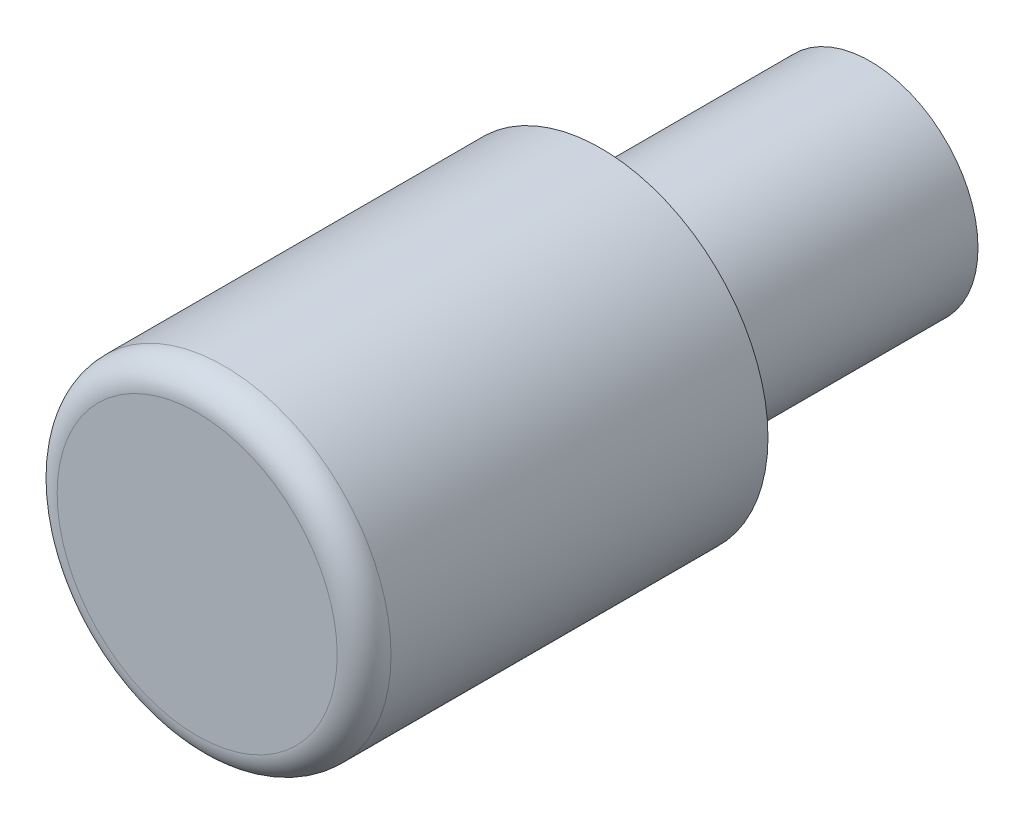
ISO-10303-21;
HEADER;
FILE_DESCRIPTION(('STEP AP214'),'2;1');
FILE_NAME('part.step','',(''),(''),'','','');
FILE_SCHEMA(('AUTOMOTIVE_DESIGN { 1 0 10303 214 1 1 1 1 }'));
ENDSEC;
DATA;
#1=APPLICATION_CONTEXT('core data for automotive mechanical design processes');
#2=APPLICATION_PROTOCOL_DEFINITION('international standard','automotive_design',2000,#1);
#3=PRODUCT_CONTEXT('',#1,'mechanical');
#4=PRODUCT('Part','Part','',(#3));
#5=PRODUCT_RELATED_PRODUCT_CATEGORY('part','',(#4));
#6=PRODUCT_DEFINITION_FORMATION('','',#4);
#7=PRODUCT_DEFINITION_CONTEXT('part definition',#1,'design');
#8=PRODUCT_DEFINITION('design','',#6,#7);
#9=PRODUCT_DEFINITION_SHAPE('','',#8);
#10=(LENGTH_UNIT() NAMED_UNIT(*) SI_UNIT(.MILLI.,.METRE.));
#11=(NAMED_UNIT(*) PLANE_ANGLE_UNIT() SI_UNIT($,.RADIAN.));
#12=(NAMED_UNIT(*) SI_UNIT($,.STERADIAN.) SOLID_ANGLE_UNIT());
#13=UNCERTAINTY_MEASURE_WITH_UNIT(LENGTH_MEASURE(1.E-05),#10,'distance_accuracy_value','');
#14=(GEOMETRIC_REPRESENTATION_CONTEXT(3) GLOBAL_UNCERTAINTY_ASSIGNED_CONTEXT((#13)) GLOBAL_UNIT_ASSIGNED_CONTEXT((#10,
#11,#12)) REPRESENTATION_CONTEXT('',''));
#15=CARTESIAN_POINT('',(0.,0.,0.));
#16=DIRECTION('',(0.,0.,1.));
#17=DIRECTION('',(1.,0.,0.));
#18=AXIS2_PLACEMENT_3D('',#15,#16,#17);
#19=CARTESIAN_POINT('',(0.,0.,0.));
#20=DIRECTION('',(0.,0.,1.));
#21=DIRECTION('',(1.,0.,0.));
#22=AXIS2_PLACEMENT_3D('',#19,#20,#21);
#23=PLANE('',#22);
#24=CARTESIAN_POINT('',(0.,0.,0.));
#25=DIRECTION('',(0.,0.,1.));
#26=DIRECTION('',(1.,0.,0.));
#27=AXIS2_PLACEMENT_3D('',#24,#25,#26);
#28=CIRCLE('',#27,1.5748);
#29=CARTESIAN_POINT('',(-1.5748,0.,0.));
#30=VERTEX_POINT('',#29);
#31=EDGE_CURVE('E46',#30,#30,#28,.T.);
#32=ORIENTED_EDGE('',*,*,#31,.F.);
#33=EDGE_LOOP('',(#32));
#34=FACE_BOUND('',#33,.T.);
#35=CARTESIAN_POINT('',(0.,0.,0.));
#36=DIRECTION('',(0.,0.,1.));
#37=DIRECTION('',(1.,0.,0.));
#38=AXIS2_PLACEMENT_3D('',#35,#36,#37);
#39=CIRCLE('',#38,1.016);
#40=CARTESIAN_POINT('',(1.016,0.,0.));
#41=VERTEX_POINT('',#40);
#42=EDGE_CURVE('E42',#41,#41,#39,.F.);
#43=ORIENTED_EDGE('',*,*,#42,.F.);
#44=EDGE_LOOP('',(#43));
#45=FACE_BOUND('',#44,.T.);
#46=ADVANCED_FACE('F31',(#34,#45),#23,.F.);
#47=CARTESIAN_POINT('',(0.,0.,3.81));
#48=DIRECTION('',(0.,0.,-1.));
#49=DIRECTION('',(-1.,0.,0.));
#50=AXIS2_PLACEMENT_3D('',#47,#48,#49);
#51=CYLINDRICAL_SURFACE('',#50,1.5748);
#52=CARTESIAN_POINT('',(0.,0.,3.556));
#53=DIRECTION('',(0.,0.,1.));
#54=DIRECTION('',(1.,0.,0.));
#55=AXIS2_PLACEMENT_3D('',#52,#53,#54);
#56=CIRCLE('',#55,1.5748);
#57=CARTESIAN_POINT('',(-1.5748,0.,3.556));
#58=VERTEX_POINT('',#57);
#59=EDGE_CURVE('E10',#58,#58,#56,.F.);
#60=CARTESIAN_POINT('',(-1.5748,0.,3.556));
#61=CARTESIAN_POINT('',(-1.5748,0.,3.51895833333333));
#62=CARTESIAN_POINT('',(-1.5748,0.,3.48191666666667));
#63=CARTESIAN_POINT('',(-1.5748,0.,3.40783333333333));
#64=CARTESIAN_POINT('',(-1.5748,0.,3.37079166666667));
#65=CARTESIAN_POINT('',(-1.5748,0.,3.29670833333333));
#66=CARTESIAN_POINT('',(-1.5748,0.,3.25966666666667));
#67=CARTESIAN_POINT('',(-1.5748,0.,3.18558333333333));
#68=CARTESIAN_POINT('',(-1.5748,0.,3.14854166666667));
#69=CARTESIAN_POINT('',(-1.5748,0.,3.07445833333333));
#70=CARTESIAN_POINT('',(-1.5748,0.,3.03741666666667));
#71=CARTESIAN_POINT('',(-1.5748,0.,2.96333333333333));
#72=CARTESIAN_POINT('',(-1.5748,0.,2.92629166666667));
#73=CARTESIAN_POINT('',(-1.5748,0.,2.85220833333333));
#74=CARTESIAN_POINT('',(-1.5748,0.,2.81516666666667));
#75=CARTESIAN_POINT('',(-1.5748,0.,2.74108333333333));
#76=CARTESIAN_POINT('',(-1.5748,0.,2.70404166666667));
#77=CARTESIAN_POINT('',(-1.5748,0.,2.62995833333333));
#78=CARTESIAN_POINT('',(-1.5748,0.,2.59291666666667));
#79=CARTESIAN_POINT('',(-1.5748,0.,2.51883333333333));
#80=CARTESIAN_POINT('',(-1.5748,0.,2.48179166666667));
#81=CARTESIAN_POINT('',(-1.5748,0.,2.40770833333333));
#82=CARTESIAN_POINT('',(-1.5748,0.,2.37066666666667));
#83=CARTESIAN_POINT('',(-1.5748,0.,2.29658333333333));
#84=CARTESIAN_POINT('',(-1.5748,0.,2.25954166666667));
#85=CARTESIAN_POINT('',(-1.5748,0.,2.18545833333333));
#86=CARTESIAN_POINT('',(-1.5748,0.,2.14841666666667));
#87=CARTESIAN_POINT('',(-1.5748,0.,2.07433333333333));
#88=CARTESIAN_POINT('',(-1.5748,0.,2.03729166666667));
#89=CARTESIAN_POINT('',(-1.5748,0.,1.96320833333333));
#90=CARTESIAN_POINT('',(-1.5748,0.,1.92616666666667));
#91=CARTESIAN_POINT('',(-1.5748,0.,1.85208333333333));
#92=CARTESIAN_POINT('',(-1.5748,0.,1.81504166666667));
#93=CARTESIAN_POINT('',(-1.5748,0.,1.74095833333333));
#94=CARTESIAN_POINT('',(-1.5748,0.,1.70391666666667));
#95=CARTESIAN_POINT('',(-1.5748,0.,1.62983333333333));
#96=CARTESIAN_POINT('',(-1.5748,0.,1.59279166666667));
#97=CARTESIAN_POINT('',(-1.5748,0.,1.51870833333333));
#98=CARTESIAN_POINT('',(-1.5748,0.,1.48166666666667));
#99=CARTESIAN_POINT('',(-1.5748,0.,1.40758333333333));
#100=CARTESIAN_POINT('',(-1.5748,0.,1.37054166666667));
#101=CARTESIAN_POINT('',(-1.5748,0.,1.29645833333333));
#102=CARTESIAN_POINT('',(-1.5748,0.,1.25941666666667));
#103=CARTESIAN_POINT('',(-1.5748,0.,1.18533333333333));
#104=CARTESIAN_POINT('',(-1.5748,0.,1.14829166666667));
#105=CARTESIAN_POINT('',(-1.5748,0.,1.07420833333333));
#106=CARTESIAN_POINT('',(-1.5748,0.,1.03716666666667));
#107=CARTESIAN_POINT('',(-1.5748,0.,0.963083333333334));
#108=CARTESIAN_POINT('',(-1.5748,0.,0.926041666666667));
#109=CARTESIAN_POINT('',(-1.5748,0.,0.851958333333333));
#110=CARTESIAN_POINT('',(-1.5748,0.,0.814916666666667));
#111=CARTESIAN_POINT('',(-1.5748,0.,0.740833333333333));
#112=CARTESIAN_POINT('',(-1.5748,0.,0.703791666666666));
#113=CARTESIAN_POINT('',(-1.5748,0.,0.629708333333333));
#114=CARTESIAN_POINT('',(-1.5748,0.,0.592666666666666));
#115=CARTESIAN_POINT('',(-1.5748,0.,0.518583333333333));
#116=CARTESIAN_POINT('',(-1.5748,0.,0.481541666666666));
#117=CARTESIAN_POINT('',(-1.5748,0.,0.407458333333333));
#118=CARTESIAN_POINT('',(-1.5748,0.,0.370416666666666));
#119=CARTESIAN_POINT('',(-1.5748,0.,0.296333333333333));
#120=CARTESIAN_POINT('',(-1.5748,0.,0.259291666666667));
#121=CARTESIAN_POINT('',(-1.5748,0.,0.185208333333334));
#122=CARTESIAN_POINT('',(-1.5748,0.,0.148166666666667));
#123=CARTESIAN_POINT('',(-1.5748,0.,0.0740833333333334));
#124=CARTESIAN_POINT('',(-1.5748,0.,0.0370416666666668));
#125=CARTESIAN_POINT('',(-1.5748,0.,0.));
#126=B_SPLINE_CURVE_WITH_KNOTS('',3,(#60,#61,#62,#63,#64,#65,#66,#67,#68,#69,#70,#71,#72,#73,
#74,#75,#76,#77,#78,#79,#80,#81,#82,#83,#84,#85,#86,#87,#88,#89,#90,#91,#92,#93,#94,#95,#96,#97,
#98,#99,#100,#101,#102,#103,#104,#105,#106,#107,#108,#109,#110,#111,#112,#113,#114,#115,#116,
#117,#118,#119,#120,#121,#122,#123,#124,#125),.UNSPECIFIED.,.F.,.F.,(4,2,2,2,2,2,2,2,2,2,2,2,2,
2,2,2,2,2,2,2,2,2,2,2,2,2,2,2,2,2,2,2,4),(0.,0.111125,0.22225,0.333375,0.4445,0.555625,0.66675,
0.777875,0.889,1.000125,1.11125,1.222375,1.3335,1.444625,1.55575,1.666875,1.778,1.889125,
2.00025,2.111375,2.2225,2.333625,2.44475,2.555875,2.667,2.778125,2.88925,3.000375,3.1115,
3.222625,3.33375,3.444875,3.556),.UNSPECIFIED.);
#127=EDGE_CURVE('BSEAM65',#58,#30,#126,.T.);
#128=ORIENTED_EDGE('',*,*,#59,.T.);
#129=ORIENTED_EDGE('',*,*,#31,.T.);
#130=ORIENTED_EDGE('',*,*,#127,.T.);
#131=ORIENTED_EDGE('',*,*,#127,.F.);
#132=EDGE_LOOP('',(#128,#130,#129,#131));
#133=FACE_BOUND('',#132,.T.);
#134=ADVANCED_FACE('F65',(#133),#51,.T.);
#135=CARTESIAN_POINT('',(0.,0.,3.81));
#136=DIRECTION('',(0.,0.,1.));
#137=DIRECTION('',(1.,0.,0.));
#138=AXIS2_PLACEMENT_3D('',#135,#136,#137);
#139=PLANE('',#138);
#140=CARTESIAN_POINT('',(0.,0.,3.81));
#141=DIRECTION('',(0.,0.,1.));
#142=DIRECTION('',(1.,0.,0.));
#143=AXIS2_PLACEMENT_3D('',#140,#141,#142);
#144=CIRCLE('',#143,1.3208);
#145=CARTESIAN_POINT('',(1.3208,0.,3.81));
#146=VERTEX_POINT('',#145);
#147=EDGE_CURVE('E38',#146,#146,#144,.T.);
#148=ORIENTED_EDGE('',*,*,#147,.T.);
#149=EDGE_LOOP('',(#148));
#150=FACE_BOUND('',#149,.T.);
#151=ADVANCED_FACE('F60',(#150),#139,.T.);
#152=CARTESIAN_POINT('',(0.,0.,-2.54));
#153=DIRECTION('',(0.,0.,1.));
#154=DIRECTION('',(1.,0.,0.));
#155=AXIS2_PLACEMENT_3D('',#152,#153,#154);
#156=CYLINDRICAL_SURFACE('',#155,1.016);
#157=CARTESIAN_POINT('',(0.,0.,-2.54));
#158=DIRECTION('',(0.,0.,-1.));
#159=DIRECTION('',(-1.,0.,0.));
#160=AXIS2_PLACEMENT_3D('',#157,#158,#159);
#161=CIRCLE('',#160,1.016);
#162=CARTESIAN_POINT('',(-1.016,0.,-2.54));
#163=VERTEX_POINT('',#162);
#164=EDGE_CURVE('E51',#163,#163,#161,.T.);
#165=ORIENTED_EDGE('',*,*,#164,.F.);
#166=EDGE_LOOP('',(#165));
#167=FACE_BOUND('',#166,.T.);
#168=ORIENTED_EDGE('',*,*,#42,.T.);
#169=EDGE_LOOP('',(#168));
#170=FACE_BOUND('',#169,.T.);
#171=ADVANCED_FACE('F57',(#167,#170),#156,.T.);
#172=CARTESIAN_POINT('',(0.,0.,-2.54));
#173=DIRECTION('',(0.,0.,-1.));
#174=DIRECTION('',(-1.,0.,0.));
#175=AXIS2_PLACEMENT_3D('',#172,#173,#174);
#176=PLANE('',#175);
#177=ORIENTED_EDGE('',*,*,#164,.T.);
#178=EDGE_LOOP('',(#177));
#179=FACE_BOUND('',#178,.T.);
#180=ADVANCED_FACE('F55',(#179),#176,.T.);
#181=CARTESIAN_POINT('',(0.,0.,3.556));
#182=DIRECTION('',(0.,0.,1.));
#183=DIRECTION('',(1.,0.,0.));
#184=AXIS2_PLACEMENT_3D('',#181,#182,#183);
#185=TOROIDAL_SURFACE('',#184,1.3208,0.254);
#186=ORIENTED_EDGE('',*,*,#59,.F.);
#187=EDGE_LOOP('',(#186));
#188=FACE_BOUND('',#187,.T.);
#189=ORIENTED_EDGE('',*,*,#147,.F.);
#190=EDGE_LOOP('',(#189));
#191=FACE_BOUND('',#190,.T.);
#192=ADVANCED_FACE('F33',(#188,#191),#185,.T.);
#193=CLOSED_SHELL('',(#46,#134,#151,#171,#180,#192));
#194=MANIFOLD_SOLID_BREP('B2',#193);
#195=ADVANCED_BREP_SHAPE_REPRESENTATION('',(#18,#194),#14);
#196=SHAPE_DEFINITION_REPRESENTATION(#9,#195);
ENDSEC;
END-ISO-10303-21;
